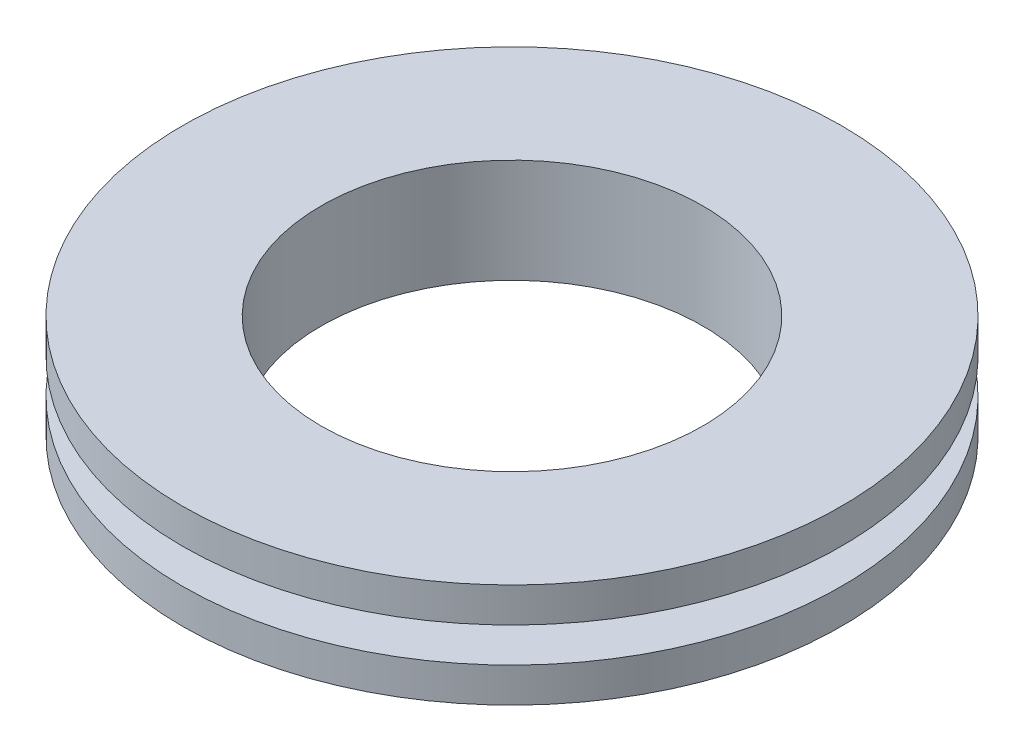
ISO-10303-21;
HEADER;
FILE_DESCRIPTION(('STEP AP214'),'2;1');
FILE_NAME('part.step','',(''),(''),'','','');
FILE_SCHEMA(('AUTOMOTIVE_DESIGN { 1 0 10303 214 1 1 1 1 }'));
ENDSEC;
DATA;
#1=APPLICATION_CONTEXT('core data for automotive mechanical design processes');
#2=APPLICATION_PROTOCOL_DEFINITION('international standard','automotive_design',2000,#1);
#3=PRODUCT_CONTEXT('',#1,'mechanical');
#4=PRODUCT('Part','Part','',(#3));
#5=PRODUCT_RELATED_PRODUCT_CATEGORY('part','',(#4));
#6=PRODUCT_DEFINITION_FORMATION('','',#4);
#7=PRODUCT_DEFINITION_CONTEXT('part definition',#1,'design');
#8=PRODUCT_DEFINITION('design','',#6,#7);
#9=PRODUCT_DEFINITION_SHAPE('','',#8);
#10=(LENGTH_UNIT() NAMED_UNIT(*) SI_UNIT(.MILLI.,.METRE.));
#11=(NAMED_UNIT(*) PLANE_ANGLE_UNIT() SI_UNIT($,.RADIAN.));
#12=(NAMED_UNIT(*) SI_UNIT($,.STERADIAN.) SOLID_ANGLE_UNIT());
#13=UNCERTAINTY_MEASURE_WITH_UNIT(LENGTH_MEASURE(1.E-05),#10,'distance_accuracy_value','');
#14=(GEOMETRIC_REPRESENTATION_CONTEXT(3) GLOBAL_UNCERTAINTY_ASSIGNED_CONTEXT((#13)) GLOBAL_UNIT_ASSIGNED_CONTEXT((#10,
#11,#12)) REPRESENTATION_CONTEXT('',''));
#15=CARTESIAN_POINT('',(0.,0.,0.));
#16=DIRECTION('',(0.,0.,1.));
#17=DIRECTION('',(1.,0.,0.));
#18=AXIS2_PLACEMENT_3D('',#15,#16,#17);
#19=CARTESIAN_POINT('',(0.,3.,0.));
#20=DIRECTION('',(0.,1.,0.));
#21=DIRECTION('',(0.,0.,1.));
#22=AXIS2_PLACEMENT_3D('',#19,#20,#21);
#23=PLANE('',#22);
#24=CARTESIAN_POINT('',(0.,3.,0.));
#25=DIRECTION('',(0.,1.,0.));
#26=DIRECTION('',(0.,0.,1.));
#27=AXIS2_PLACEMENT_3D('',#24,#25,#26);
#28=CIRCLE('',#27,5.5);
#29=CARTESIAN_POINT('',(0.,3.,5.5));
#30=VERTEX_POINT('',#29);
#31=EDGE_CURVE('E57',#30,#30,#28,.T.);
#32=ORIENTED_EDGE('',*,*,#31,.F.);
#33=EDGE_LOOP('',(#32));
#34=FACE_BOUND('',#33,.T.);
#35=CARTESIAN_POINT('',(0.,3.,0.));
#36=DIRECTION('',(0.,1.,0.));
#37=DIRECTION('',(0.,0.,1.));
#38=AXIS2_PLACEMENT_3D('',#35,#36,#37);
#39=CIRCLE('',#38,9.5);
#40=CARTESIAN_POINT('',(0.,3.,9.5));
#41=VERTEX_POINT('',#40);
#42=EDGE_CURVE('E68',#41,#41,#39,.T.);
#43=ORIENTED_EDGE('',*,*,#42,.T.);
#44=EDGE_LOOP('',(#43));
#45=FACE_BOUND('',#44,.T.);
#46=ADVANCED_FACE('F43',(#34,#45),#23,.T.);
#47=CARTESIAN_POINT('',(0.,0.,0.));
#48=DIRECTION('',(0.,1.,0.));
#49=DIRECTION('',(0.,0.,1.));
#50=AXIS2_PLACEMENT_3D('',#47,#48,#49);
#51=PLANE('',#50);
#52=CARTESIAN_POINT('',(0.,0.,0.));
#53=DIRECTION('',(0.,1.,0.));
#54=DIRECTION('',(0.,0.,1.));
#55=AXIS2_PLACEMENT_3D('',#52,#53,#54);
#56=CIRCLE('',#55,5.5);
#57=CARTESIAN_POINT('',(0.,0.,5.5));
#58=VERTEX_POINT('',#57);
#59=EDGE_CURVE('E60',#58,#58,#56,.T.);
#60=ORIENTED_EDGE('',*,*,#59,.T.);
#61=EDGE_LOOP('',(#60));
#62=FACE_BOUND('',#61,.T.);
#63=CARTESIAN_POINT('',(0.,0.,0.));
#64=DIRECTION('',(0.,-1.,0.));
#65=DIRECTION('',(0.,0.,-1.));
#66=AXIS2_PLACEMENT_3D('',#63,#64,#65);
#67=CIRCLE('',#66,9.5);
#68=CARTESIAN_POINT('',(0.,0.,-9.5));
#69=VERTEX_POINT('',#68);
#70=EDGE_CURVE('E76',#69,#69,#67,.T.);
#71=ORIENTED_EDGE('',*,*,#70,.T.);
#72=EDGE_LOOP('',(#71));
#73=FACE_BOUND('',#72,.T.);
#74=ADVANCED_FACE('F100',(#62,#73),#51,.F.);
#75=CARTESIAN_POINT('',(0.,3.,0.));
#76=DIRECTION('',(0.,-1.,0.));
#77=DIRECTION('',(0.,0.,-1.));
#78=AXIS2_PLACEMENT_3D('',#75,#76,#77);
#79=CYLINDRICAL_SURFACE('',#78,5.5);
#80=ORIENTED_EDGE('',*,*,#31,.T.);
#81=EDGE_LOOP('',(#80));
#82=FACE_BOUND('',#81,.T.);
#83=ORIENTED_EDGE('',*,*,#59,.F.);
#84=EDGE_LOOP('',(#83));
#85=FACE_BOUND('',#84,.T.);
#86=ADVANCED_FACE('F108',(#82,#85),#79,.F.);
#87=CARTESIAN_POINT('',(0.,2.,0.));
#88=DIRECTION('',(0.,1.,0.));
#89=DIRECTION('',(0.,0.,1.));
#90=AXIS2_PLACEMENT_3D('',#87,#88,#89);
#91=CYLINDRICAL_SURFACE('',#90,9.5);
#92=CARTESIAN_POINT('',(0.,2.,0.));
#93=DIRECTION('',(0.,1.,0.));
#94=DIRECTION('',(0.,0.,1.));
#95=AXIS2_PLACEMENT_3D('',#92,#93,#94);
#96=CIRCLE('',#95,9.5);
#97=CARTESIAN_POINT('',(0.,2.,9.5));
#98=VERTEX_POINT('',#97);
#99=EDGE_CURVE('E64',#98,#98,#96,.T.);
#100=ORIENTED_EDGE('',*,*,#99,.T.);
#101=EDGE_LOOP('',(#100));
#102=FACE_BOUND('',#101,.T.);
#103=ORIENTED_EDGE('',*,*,#42,.F.);
#104=EDGE_LOOP('',(#103));
#105=FACE_BOUND('',#104,.T.);
#106=ADVANCED_FACE('F125',(#102,#105),#91,.T.);
#107=CARTESIAN_POINT('',(0.,2.,0.));
#108=DIRECTION('',(0.,1.,0.));
#109=DIRECTION('',(0.,0.,1.));
#110=AXIS2_PLACEMENT_3D('',#107,#108,#109);
#111=PLANE('',#110);
#112=CARTESIAN_POINT('',(0.,2.,0.));
#113=DIRECTION('',(0.,1.,0.));
#114=DIRECTION('',(0.,0.,1.));
#115=AXIS2_PLACEMENT_3D('',#112,#113,#114);
#116=CIRCLE('',#115,8.);
#117=CARTESIAN_POINT('',(0.,2.,8.));
#118=VERTEX_POINT('',#117);
#119=EDGE_CURVE('E52',#118,#118,#116,.T.);
#120=ORIENTED_EDGE('',*,*,#119,.T.);
#121=EDGE_LOOP('',(#120));
#122=FACE_BOUND('',#121,.T.);
#123=ORIENTED_EDGE('',*,*,#99,.F.);
#124=EDGE_LOOP('',(#123));
#125=FACE_BOUND('',#124,.T.);
#126=ADVANCED_FACE('F97',(#122,#125),#111,.F.);
#127=CARTESIAN_POINT('',(0.,1.,0.));
#128=DIRECTION('',(0.,-1.,0.));
#129=DIRECTION('',(0.,0.,-1.));
#130=AXIS2_PLACEMENT_3D('',#127,#128,#129);
#131=CYLINDRICAL_SURFACE('',#130,9.5);
#132=CARTESIAN_POINT('',(0.,1.,0.));
#133=DIRECTION('',(0.,-1.,0.));
#134=DIRECTION('',(0.,0.,-1.));
#135=AXIS2_PLACEMENT_3D('',#132,#133,#134);
#136=CIRCLE('',#135,9.5);
#137=CARTESIAN_POINT('',(0.,1.,-9.5));
#138=VERTEX_POINT('',#137);
#139=EDGE_CURVE('E72',#138,#138,#136,.T.);
#140=ORIENTED_EDGE('',*,*,#139,.T.);
#141=EDGE_LOOP('',(#140));
#142=FACE_BOUND('',#141,.T.);
#143=ORIENTED_EDGE('',*,*,#70,.F.);
#144=EDGE_LOOP('',(#143));
#145=FACE_BOUND('',#144,.T.);
#146=ADVANCED_FACE('F84',(#142,#145),#131,.T.);
#147=CARTESIAN_POINT('',(0.,1.,0.));
#148=DIRECTION('',(0.,-1.,0.));
#149=DIRECTION('',(0.,0.,-1.));
#150=AXIS2_PLACEMENT_3D('',#147,#148,#149);
#151=PLANE('',#150);
#152=CARTESIAN_POINT('',(0.,1.,0.));
#153=DIRECTION('',(0.,-1.,0.));
#154=DIRECTION('',(0.,0.,-1.));
#155=AXIS2_PLACEMENT_3D('',#152,#153,#154);
#156=CIRCLE('',#155,8.);
#157=CARTESIAN_POINT('',(0.,1.,-8.));
#158=VERTEX_POINT('',#157);
#159=EDGE_CURVE('E10',#158,#158,#156,.T.);
#160=ORIENTED_EDGE('',*,*,#159,.T.);
#161=EDGE_LOOP('',(#160));
#162=FACE_BOUND('',#161,.T.);
#163=ORIENTED_EDGE('',*,*,#139,.F.);
#164=EDGE_LOOP('',(#163));
#165=FACE_BOUND('',#164,.T.);
#166=ADVANCED_FACE('F87',(#162,#165),#151,.F.);
#167=CARTESIAN_POINT('',(0.,1.5,0.));
#168=DIRECTION('',(0.,-1.,0.));
#169=DIRECTION('',(0.,0.,-1.));
#170=AXIS2_PLACEMENT_3D('',#167,#168,#169);
#171=TOROIDAL_SURFACE('',#170,8.,0.5);
#172=ORIENTED_EDGE('',*,*,#159,.F.);
#173=EDGE_LOOP('',(#172));
#174=FACE_BOUND('',#173,.T.);
#175=CARTESIAN_POINT('',(0.,1.5,0.));
#176=DIRECTION('',(0.,-1.,0.));
#177=DIRECTION('',(0.,0.,-1.));
#178=AXIS2_PLACEMENT_3D('',#175,#176,#177);
#179=CIRCLE('',#178,7.5);
#180=CARTESIAN_POINT('',(0.,1.5,-7.5));
#181=VERTEX_POINT('',#180);
#182=EDGE_CURVE('E47',#181,#181,#179,.F.);
#183=ORIENTED_EDGE('',*,*,#182,.F.);
#184=EDGE_LOOP('',(#183));
#185=FACE_BOUND('',#184,.T.);
#186=ADVANCED_FACE('F45',(#174,#185),#171,.F.);
#187=CARTESIAN_POINT('',(0.,1.5,0.));
#188=DIRECTION('',(0.,1.,0.));
#189=DIRECTION('',(0.,0.,1.));
#190=AXIS2_PLACEMENT_3D('',#187,#188,#189);
#191=TOROIDAL_SURFACE('',#190,8.,0.5);
#192=ORIENTED_EDGE('',*,*,#182,.T.);
#193=EDGE_LOOP('',(#192));
#194=FACE_BOUND('',#193,.T.);
#195=ORIENTED_EDGE('',*,*,#119,.F.);
#196=EDGE_LOOP('',(#195));
#197=FACE_BOUND('',#196,.T.);
#198=ADVANCED_FACE('F94',(#194,#197),#191,.F.);
#199=CLOSED_SHELL('',(#46,#74,#86,#106,#126,#146,#166,#186,#198));
#200=MANIFOLD_SOLID_BREP('B2',#199);
#201=ADVANCED_BREP_SHAPE_REPRESENTATION('',(#18,#200),#14);
#202=SHAPE_DEFINITION_REPRESENTATION(#9,#201);
ENDSEC;
END-ISO-10303-21;
